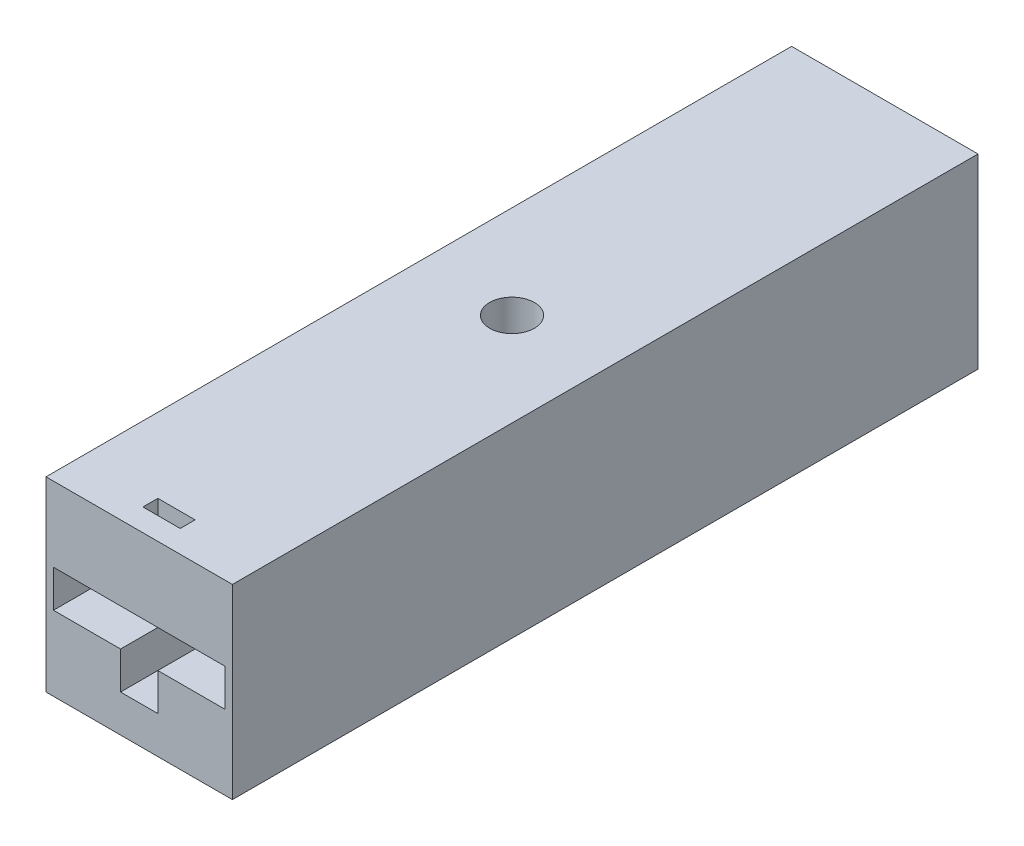
ISO-10303-21;
HEADER;
FILE_DESCRIPTION(('STEP AP214'),'2;1');
FILE_NAME('part.step','',(''),(''),'','','');
FILE_SCHEMA(('AUTOMOTIVE_DESIGN { 1 0 10303 214 1 1 1 1 }'));
ENDSEC;
DATA;
#1=APPLICATION_CONTEXT('core data for automotive mechanical design processes');
#2=APPLICATION_PROTOCOL_DEFINITION('international standard','automotive_design',2000,#1);
#3=PRODUCT_CONTEXT('',#1,'mechanical');
#4=PRODUCT('Part','Part','',(#3));
#5=PRODUCT_RELATED_PRODUCT_CATEGORY('part','',(#4));
#6=PRODUCT_DEFINITION_FORMATION('','',#4);
#7=PRODUCT_DEFINITION_CONTEXT('part definition',#1,'design');
#8=PRODUCT_DEFINITION('design','',#6,#7);
#9=PRODUCT_DEFINITION_SHAPE('','',#8);
#10=(LENGTH_UNIT() NAMED_UNIT(*) SI_UNIT(.MILLI.,.METRE.));
#11=(NAMED_UNIT(*) PLANE_ANGLE_UNIT() SI_UNIT($,.RADIAN.));
#12=(NAMED_UNIT(*) SI_UNIT($,.STERADIAN.) SOLID_ANGLE_UNIT());
#13=UNCERTAINTY_MEASURE_WITH_UNIT(LENGTH_MEASURE(1.E-05),#10,'distance_accuracy_value','');
#14=(GEOMETRIC_REPRESENTATION_CONTEXT(3) GLOBAL_UNCERTAINTY_ASSIGNED_CONTEXT((#13)) GLOBAL_UNIT_ASSIGNED_CONTEXT((#10,
#11,#12)) REPRESENTATION_CONTEXT('',''));
#15=CARTESIAN_POINT('',(0.,0.,0.));
#16=DIRECTION('',(0.,0.,1.));
#17=DIRECTION('',(1.,0.,0.));
#18=AXIS2_PLACEMENT_3D('',#15,#16,#17);
#19=CARTESIAN_POINT('',(0.,0.,0.));
#20=DIRECTION('',(0.,0.,-1.));
#21=DIRECTION('',(-1.,0.,0.));
#22=AXIS2_PLACEMENT_3D('',#19,#20,#21);
#23=PLANE('',#22);
#24=DIRECTION('',(0.,1.,0.));
#25=VECTOR('',#24,1.);
#26=CARTESIAN_POINT('',(12.5,-12.5,0.));
#27=LINE('',#26,#25);
#28=CARTESIAN_POINT('',(12.5,-12.5,0.));
#29=VERTEX_POINT('',#28);
#30=CARTESIAN_POINT('',(12.5,12.5,0.));
#31=VERTEX_POINT('',#30);
#32=EDGE_CURVE('E384',#29,#31,#27,.T.);
#33=ORIENTED_EDGE('',*,*,#32,.F.);
#34=DIRECTION('',(1.,0.,0.));
#35=VECTOR('',#34,1.);
#36=CARTESIAN_POINT('',(-12.5,-12.5,0.));
#37=LINE('',#36,#35);
#38=CARTESIAN_POINT('',(-12.5,-12.5,0.));
#39=VERTEX_POINT('',#38);
#40=EDGE_CURVE('E403',#39,#29,#37,.T.);
#41=ORIENTED_EDGE('',*,*,#40,.F.);
#42=DIRECTION('',(0.,-1.,0.));
#43=VECTOR('',#42,1.);
#44=CARTESIAN_POINT('',(-12.5,-12.5,0.));
#45=LINE('',#44,#43);
#46=CARTESIAN_POINT('',(-12.5,12.5,0.));
#47=VERTEX_POINT('',#46);
#48=EDGE_CURVE('E414',#47,#39,#45,.T.);
#49=ORIENTED_EDGE('',*,*,#48,.F.);
#50=DIRECTION('',(-1.,0.,0.));
#51=VECTOR('',#50,1.);
#52=CARTESIAN_POINT('',(-12.5,12.5,0.));
#53=LINE('',#52,#51);
#54=EDGE_CURVE('E412',#31,#47,#53,.T.);
#55=ORIENTED_EDGE('',*,*,#54,.F.);
#56=EDGE_LOOP('',(#33,#41,#49,#55));
#57=FACE_BOUND('',#56,.T.);
#58=DIRECTION('',(0.,1.,0.));
#59=VECTOR('',#58,1.);
#60=CARTESIAN_POINT('',(7.5,-2.5,0.));
#61=LINE('',#60,#59);
#62=CARTESIAN_POINT('',(7.5,-2.5,0.));
#63=VERTEX_POINT('',#62);
#64=CARTESIAN_POINT('',(7.5,2.5,0.));
#65=VERTEX_POINT('',#64);
#66=EDGE_CURVE('E276',#63,#65,#61,.T.);
#67=ORIENTED_EDGE('',*,*,#66,.T.);
#68=DIRECTION('',(-1.,0.,0.));
#69=VECTOR('',#68,1.);
#70=CARTESIAN_POINT('',(7.5,2.5,0.));
#71=LINE('',#70,#69);
#72=CARTESIAN_POINT('',(2.5,2.5,0.));
#73=VERTEX_POINT('',#72);
#74=EDGE_CURVE('E265',#65,#73,#71,.T.);
#75=ORIENTED_EDGE('',*,*,#74,.T.);
#76=DIRECTION('',(0.,1.,0.));
#77=VECTOR('',#76,1.);
#78=CARTESIAN_POINT('',(2.5,2.5,0.));
#79=LINE('',#78,#77);
#80=CARTESIAN_POINT('',(2.5,11.5,0.));
#81=VERTEX_POINT('',#80);
#82=EDGE_CURVE('E293',#73,#81,#79,.T.);
#83=ORIENTED_EDGE('',*,*,#82,.T.);
#84=DIRECTION('',(-1.,0.,0.));
#85=VECTOR('',#84,1.);
#86=CARTESIAN_POINT('',(2.5,11.5,0.));
#87=LINE('',#86,#85);
#88=CARTESIAN_POINT('',(-2.5,11.5,0.));
#89=VERTEX_POINT('',#88);
#90=EDGE_CURVE('E296',#81,#89,#87,.T.);
#91=ORIENTED_EDGE('',*,*,#90,.T.);
#92=DIRECTION('',(0.,-1.,0.));
#93=VECTOR('',#92,1.);
#94=CARTESIAN_POINT('',(-2.5,11.5,0.));
#95=LINE('',#94,#93);
#96=CARTESIAN_POINT('',(-2.5,-11.5,0.));
#97=VERTEX_POINT('',#96);
#98=EDGE_CURVE('E299',#89,#97,#95,.T.);
#99=ORIENTED_EDGE('',*,*,#98,.T.);
#100=DIRECTION('',(1.,0.,0.));
#101=VECTOR('',#100,1.);
#102=CARTESIAN_POINT('',(-2.5,-11.5,0.));
#103=LINE('',#102,#101);
#104=CARTESIAN_POINT('',(2.50000000000001,-11.5,0.));
#105=VERTEX_POINT('',#104);
#106=EDGE_CURVE('E302',#97,#105,#103,.T.);
#107=ORIENTED_EDGE('',*,*,#106,.T.);
#108=DIRECTION('',(0.,1.,0.));
#109=VECTOR('',#108,1.);
#110=CARTESIAN_POINT('',(2.50000000000001,-11.5,0.));
#111=LINE('',#110,#109);
#112=CARTESIAN_POINT('',(2.50000000000001,-2.5,0.));
#113=VERTEX_POINT('',#112);
#114=EDGE_CURVE('E305',#105,#113,#111,.T.);
#115=ORIENTED_EDGE('',*,*,#114,.T.);
#116=DIRECTION('',(1.,0.,0.));
#117=VECTOR('',#116,1.);
#118=CARTESIAN_POINT('',(2.50000000000001,-2.5,0.));
#119=LINE('',#118,#117);
#120=EDGE_CURVE('E308',#113,#63,#119,.T.);
#121=ORIENTED_EDGE('',*,*,#120,.T.);
#122=EDGE_LOOP('',(#67,#75,#83,#91,#99,#107,#115,#121));
#123=FACE_BOUND('',#122,.T.);
#124=ADVANCED_FACE('F39',(#57,#123),#23,.T.);
#125=CARTESIAN_POINT('',(12.5,-12.5,100.));
#126=DIRECTION('',(-1.,0.,0.));
#127=DIRECTION('',(0.,0.,1.));
#128=AXIS2_PLACEMENT_3D('',#125,#126,#127);
#129=PLANE('',#128);
#130=ORIENTED_EDGE('',*,*,#32,.T.);
#131=DIRECTION('',(0.,0.,-1.));
#132=VECTOR('',#131,1.);
#133=CARTESIAN_POINT('',(12.5,12.5,100.));
#134=LINE('',#133,#132);
#135=CARTESIAN_POINT('',(12.5,12.5,100.));
#136=VERTEX_POINT('',#135);
#137=EDGE_CURVE('E425',#136,#31,#134,.T.);
#138=ORIENTED_EDGE('',*,*,#137,.F.);
#139=DIRECTION('',(0.,1.,0.));
#140=VECTOR('',#139,1.);
#141=CARTESIAN_POINT('',(12.5,-12.5,100.));
#142=LINE('',#141,#140);
#143=CARTESIAN_POINT('',(12.5,-12.5,100.));
#144=VERTEX_POINT('',#143);
#145=EDGE_CURVE('E399',#144,#136,#142,.T.);
#146=ORIENTED_EDGE('',*,*,#145,.F.);
#147=DIRECTION('',(0.,0.,-1.));
#148=VECTOR('',#147,1.);
#149=CARTESIAN_POINT('',(12.5,-12.5,100.));
#150=LINE('',#149,#148);
#151=EDGE_CURVE('E409',#144,#29,#150,.T.);
#152=ORIENTED_EDGE('',*,*,#151,.T.);
#153=EDGE_LOOP('',(#130,#138,#146,#152));
#154=FACE_BOUND('',#153,.T.);
#155=ADVANCED_FACE('F41',(#154),#129,.F.);
#156=CARTESIAN_POINT('',(-12.5,12.5,100.));
#157=DIRECTION('',(0.,-1.,0.));
#158=DIRECTION('',(0.,0.,-1.));
#159=AXIS2_PLACEMENT_3D('',#156,#157,#158);
#160=PLANE('',#159);
#161=DIRECTION('',(-1.,0.,0.));
#162=VECTOR('',#161,1.);
#163=CARTESIAN_POINT('',(-2.50000000000002,12.5,95.));
#164=LINE('',#163,#162);
#165=CARTESIAN_POINT('',(2.49999999999998,12.5,95.));
#166=VERTEX_POINT('',#165);
#167=CARTESIAN_POINT('',(-2.50000000000002,12.5,95.));
#168=VERTEX_POINT('',#167);
#169=EDGE_CURVE('E253',#166,#168,#164,.T.);
#170=ORIENTED_EDGE('',*,*,#169,.F.);
#171=DIRECTION('',(0.,0.,-1.));
#172=VECTOR('',#171,1.);
#173=CARTESIAN_POINT('',(2.49999999999998,12.5,97.));
#174=LINE('',#173,#172);
#175=CARTESIAN_POINT('',(2.49999999999998,12.5,97.));
#176=VERTEX_POINT('',#175);
#177=EDGE_CURVE('E249',#176,#166,#174,.T.);
#178=ORIENTED_EDGE('',*,*,#177,.F.);
#179=DIRECTION('',(1.,0.,0.));
#180=VECTOR('',#179,1.);
#181=CARTESIAN_POINT('',(-2.50000000000002,12.5,97.));
#182=LINE('',#181,#180);
#183=CARTESIAN_POINT('',(-2.50000000000002,12.5,97.));
#184=VERTEX_POINT('',#183);
#185=EDGE_CURVE('E259',#184,#176,#182,.T.);
#186=ORIENTED_EDGE('',*,*,#185,.F.);
#187=DIRECTION('',(0.,0.,1.));
#188=VECTOR('',#187,1.);
#189=CARTESIAN_POINT('',(-2.50000000000002,12.5,97.));
#190=LINE('',#189,#188);
#191=EDGE_CURVE('E256',#168,#184,#190,.T.);
#192=ORIENTED_EDGE('',*,*,#191,.F.);
#193=EDGE_LOOP('',(#170,#178,#186,#192));
#194=FACE_BOUND('',#193,.T.);
#195=CARTESIAN_POINT('',(0.,12.5,50.));
#196=DIRECTION('',(0.,1.,0.));
#197=DIRECTION('',(0.,0.,1.));
#198=AXIS2_PLACEMENT_3D('',#195,#196,#197);
#199=CIRCLE('',#198,3.);
#200=CARTESIAN_POINT('',(0.,12.5,53.));
#201=VERTEX_POINT('',#200);
#202=EDGE_CURVE('E330',#201,#201,#199,.T.);
#203=ORIENTED_EDGE('',*,*,#202,.F.);
#204=EDGE_LOOP('',(#203));
#205=FACE_BOUND('',#204,.T.);
#206=ORIENTED_EDGE('',*,*,#54,.T.);
#207=DIRECTION('',(0.,0.,-1.));
#208=VECTOR('',#207,1.);
#209=CARTESIAN_POINT('',(-12.5,12.5,100.));
#210=LINE('',#209,#208);
#211=CARTESIAN_POINT('',(-12.5,12.5,100.));
#212=VERTEX_POINT('',#211);
#213=EDGE_CURVE('E422',#212,#47,#210,.T.);
#214=ORIENTED_EDGE('',*,*,#213,.F.);
#215=DIRECTION('',(-1.,0.,0.));
#216=VECTOR('',#215,1.);
#217=CARTESIAN_POINT('',(-12.5,12.5,100.));
#218=LINE('',#217,#216);
#219=EDGE_CURVE('E402',#136,#212,#218,.T.);
#220=ORIENTED_EDGE('',*,*,#219,.F.);
#221=ORIENTED_EDGE('',*,*,#137,.T.);
#222=EDGE_LOOP('',(#206,#214,#220,#221));
#223=FACE_BOUND('',#222,.T.);
#224=ADVANCED_FACE('F475',(#194,#205,#223),#160,.F.);
#225=CARTESIAN_POINT('',(-12.5,-12.5,100.));
#226=DIRECTION('',(1.,0.,0.));
#227=DIRECTION('',(0.,0.,-1.));
#228=AXIS2_PLACEMENT_3D('',#225,#226,#227);
#229=PLANE('',#228);
#230=DIRECTION('',(0.,0.,-1.));
#231=VECTOR('',#230,1.);
#232=CARTESIAN_POINT('',(-12.5,2.5,3.));
#233=LINE('',#232,#231);
#234=CARTESIAN_POINT('',(-12.5,2.5,5.));
#235=VERTEX_POINT('',#234);
#236=CARTESIAN_POINT('',(-12.5,2.5,3.));
#237=VERTEX_POINT('',#236);
#238=EDGE_CURVE('E235',#235,#237,#233,.T.);
#239=ORIENTED_EDGE('',*,*,#238,.F.);
#240=DIRECTION('',(0.,1.,0.));
#241=VECTOR('',#240,1.);
#242=CARTESIAN_POINT('',(-12.5,-2.5,5.));
#243=LINE('',#242,#241);
#244=CARTESIAN_POINT('',(-12.5,-2.5,5.));
#245=VERTEX_POINT('',#244);
#246=EDGE_CURVE('E54',#245,#235,#243,.T.);
#247=ORIENTED_EDGE('',*,*,#246,.F.);
#248=DIRECTION('',(0.,0.,1.));
#249=VECTOR('',#248,1.);
#250=CARTESIAN_POINT('',(-12.5,-2.5,3.));
#251=LINE('',#250,#249);
#252=CARTESIAN_POINT('',(-12.5,-2.5,3.));
#253=VERTEX_POINT('',#252);
#254=EDGE_CURVE('E242',#253,#245,#251,.T.);
#255=ORIENTED_EDGE('',*,*,#254,.F.);
#256=DIRECTION('',(0.,-1.,0.));
#257=VECTOR('',#256,1.);
#258=CARTESIAN_POINT('',(-12.5,-2.5,3.));
#259=LINE('',#258,#257);
#260=EDGE_CURVE('E226',#237,#253,#259,.T.);
#261=ORIENTED_EDGE('',*,*,#260,.F.);
#262=EDGE_LOOP('',(#239,#247,#255,#261));
#263=FACE_BOUND('',#262,.T.);
#264=ORIENTED_EDGE('',*,*,#48,.T.);
#265=DIRECTION('',(0.,0.,-1.));
#266=VECTOR('',#265,1.);
#267=CARTESIAN_POINT('',(-12.5,-12.5,100.));
#268=LINE('',#267,#266);
#269=CARTESIAN_POINT('',(-12.5,-12.5,100.));
#270=VERTEX_POINT('',#269);
#271=EDGE_CURVE('E419',#270,#39,#268,.T.);
#272=ORIENTED_EDGE('',*,*,#271,.F.);
#273=DIRECTION('',(0.,-1.,0.));
#274=VECTOR('',#273,1.);
#275=CARTESIAN_POINT('',(-12.5,-12.5,100.));
#276=LINE('',#275,#274);
#277=EDGE_CURVE('E405',#212,#270,#276,.T.);
#278=ORIENTED_EDGE('',*,*,#277,.F.);
#279=ORIENTED_EDGE('',*,*,#213,.T.);
#280=EDGE_LOOP('',(#264,#272,#278,#279));
#281=FACE_BOUND('',#280,.T.);
#282=ADVANCED_FACE('F239',(#263,#281),#229,.F.);
#283=CARTESIAN_POINT('',(-12.5,-12.5,100.));
#284=DIRECTION('',(0.,1.,0.));
#285=DIRECTION('',(0.,0.,1.));
#286=AXIS2_PLACEMENT_3D('',#283,#284,#285);
#287=PLANE('',#286);
#288=CARTESIAN_POINT('',(0.,-12.5,50.));
#289=DIRECTION('',(0.,1.,0.));
#290=DIRECTION('',(0.,0.,1.));
#291=AXIS2_PLACEMENT_3D('',#288,#289,#290);
#292=CIRCLE('',#291,3.);
#293=CARTESIAN_POINT('',(0.,-12.5,53.));
#294=VERTEX_POINT('',#293);
#295=EDGE_CURVE('E333',#294,#294,#292,.T.);
#296=ORIENTED_EDGE('',*,*,#295,.T.);
#297=EDGE_LOOP('',(#296));
#298=FACE_BOUND('',#297,.T.);
#299=ORIENTED_EDGE('',*,*,#40,.T.);
#300=ORIENTED_EDGE('',*,*,#151,.F.);
#301=DIRECTION('',(1.,0.,0.));
#302=VECTOR('',#301,1.);
#303=CARTESIAN_POINT('',(-12.5,-12.5,100.));
#304=LINE('',#303,#302);
#305=EDGE_CURVE('E407',#270,#144,#304,.T.);
#306=ORIENTED_EDGE('',*,*,#305,.F.);
#307=ORIENTED_EDGE('',*,*,#271,.T.);
#308=EDGE_LOOP('',(#299,#300,#306,#307));
#309=FACE_BOUND('',#308,.T.);
#310=ADVANCED_FACE('F483',(#298,#309),#287,.F.);
#311=CARTESIAN_POINT('',(0.,0.,100.));
#312=DIRECTION('',(0.,0.,-1.));
#313=DIRECTION('',(-1.,0.,0.));
#314=AXIS2_PLACEMENT_3D('',#311,#312,#313);
#315=PLANE('',#314);
#316=DIRECTION('',(-1.,0.,0.));
#317=VECTOR('',#316,1.);
#318=CARTESIAN_POINT('',(-11.5,2.5,100.));
#319=LINE('',#318,#317);
#320=CARTESIAN_POINT('',(11.5,2.5,100.));
#321=VERTEX_POINT('',#320);
#322=CARTESIAN_POINT('',(-11.5,2.5,100.));
#323=VERTEX_POINT('',#322);
#324=EDGE_CURVE('E362',#321,#323,#319,.T.);
#325=ORIENTED_EDGE('',*,*,#324,.F.);
#326=DIRECTION('',(0.,1.,0.));
#327=VECTOR('',#326,1.);
#328=CARTESIAN_POINT('',(11.5,2.5,100.));
#329=LINE('',#328,#327);
#330=CARTESIAN_POINT('',(11.5,-2.5,100.));
#331=VERTEX_POINT('',#330);
#332=EDGE_CURVE('E360',#331,#321,#329,.T.);
#333=ORIENTED_EDGE('',*,*,#332,.F.);
#334=DIRECTION('',(1.,0.,0.));
#335=VECTOR('',#334,1.);
#336=CARTESIAN_POINT('',(11.5,-2.5,100.));
#337=LINE('',#336,#335);
#338=CARTESIAN_POINT('',(2.5,-2.5,100.));
#339=VERTEX_POINT('',#338);
#340=EDGE_CURVE('E338',#339,#331,#337,.T.);
#341=ORIENTED_EDGE('',*,*,#340,.F.);
#342=DIRECTION('',(0.,1.,0.));
#343=VECTOR('',#342,1.);
#344=CARTESIAN_POINT('',(2.5,-2.5,100.));
#345=LINE('',#344,#343);
#346=CARTESIAN_POINT('',(2.5,-7.5,100.));
#347=VERTEX_POINT('',#346);
#348=EDGE_CURVE('E377',#347,#339,#345,.T.);
#349=ORIENTED_EDGE('',*,*,#348,.F.);
#350=DIRECTION('',(1.,0.,0.));
#351=VECTOR('',#350,1.);
#352=CARTESIAN_POINT('',(2.5,-7.5,100.));
#353=LINE('',#352,#351);
#354=CARTESIAN_POINT('',(-2.5,-7.5,100.));
#355=VERTEX_POINT('',#354);
#356=EDGE_CURVE('E374',#355,#347,#353,.T.);
#357=ORIENTED_EDGE('',*,*,#356,.F.);
#358=DIRECTION('',(0.,-1.,0.));
#359=VECTOR('',#358,1.);
#360=CARTESIAN_POINT('',(-2.5,-7.5,100.));
#361=LINE('',#360,#359);
#362=CARTESIAN_POINT('',(-2.5,-2.5,100.));
#363=VERTEX_POINT('',#362);
#364=EDGE_CURVE('E371',#363,#355,#361,.T.);
#365=ORIENTED_EDGE('',*,*,#364,.F.);
#366=DIRECTION('',(1.,0.,0.));
#367=VECTOR('',#366,1.);
#368=CARTESIAN_POINT('',(-2.5,-2.5,100.));
#369=LINE('',#368,#367);
#370=CARTESIAN_POINT('',(-11.5,-2.5,100.));
#371=VERTEX_POINT('',#370);
#372=EDGE_CURVE('E368',#371,#363,#369,.T.);
#373=ORIENTED_EDGE('',*,*,#372,.F.);
#374=DIRECTION('',(0.,-1.,0.));
#375=VECTOR('',#374,1.);
#376=CARTESIAN_POINT('',(-11.5,-2.5,100.));
#377=LINE('',#376,#375);
#378=EDGE_CURVE('E365',#323,#371,#377,.T.);
#379=ORIENTED_EDGE('',*,*,#378,.F.);
#380=EDGE_LOOP('',(#325,#333,#341,#349,#357,#365,#373,#379));
#381=FACE_BOUND('',#380,.T.);
#382=ORIENTED_EDGE('',*,*,#145,.T.);
#383=ORIENTED_EDGE('',*,*,#219,.T.);
#384=ORIENTED_EDGE('',*,*,#277,.T.);
#385=ORIENTED_EDGE('',*,*,#305,.T.);
#386=EDGE_LOOP('',(#382,#383,#384,#385));
#387=FACE_BOUND('',#386,.T.);
#388=ADVANCED_FACE('F481',(#381,#387),#315,.F.);
#389=CARTESIAN_POINT('',(11.5,2.5,90.));
#390=DIRECTION('',(1.,0.,0.));
#391=DIRECTION('',(0.,0.,-1.));
#392=AXIS2_PLACEMENT_3D('',#389,#390,#391);
#393=PLANE('',#392);
#394=ORIENTED_EDGE('',*,*,#332,.T.);
#395=DIRECTION('',(0.,0.,1.));
#396=VECTOR('',#395,1.);
#397=CARTESIAN_POINT('',(11.5,2.5,90.));
#398=LINE('',#397,#396);
#399=CARTESIAN_POINT('',(11.5,2.5,90.));
#400=VERTEX_POINT('',#399);
#401=EDGE_CURVE('E359',#400,#321,#398,.T.);
#402=ORIENTED_EDGE('',*,*,#401,.F.);
#403=DIRECTION('',(0.,1.,0.));
#404=VECTOR('',#403,1.);
#405=CARTESIAN_POINT('',(11.5,2.5,90.));
#406=LINE('',#405,#404);
#407=CARTESIAN_POINT('',(11.5,-2.5,90.));
#408=VERTEX_POINT('',#407);
#409=EDGE_CURVE('E334',#408,#400,#406,.T.);
#410=ORIENTED_EDGE('',*,*,#409,.F.);
#411=DIRECTION('',(0.,0.,1.));
#412=VECTOR('',#411,1.);
#413=CARTESIAN_POINT('',(11.5,-2.5,90.));
#414=LINE('',#413,#412);
#415=EDGE_CURVE('E382',#408,#331,#414,.T.);
#416=ORIENTED_EDGE('',*,*,#415,.T.);
#417=EDGE_LOOP('',(#394,#402,#410,#416));
#418=FACE_BOUND('',#417,.T.);
#419=ADVANCED_FACE('F512',(#418),#393,.F.);
#420=CARTESIAN_POINT('',(11.5,-2.5,90.));
#421=DIRECTION('',(0.,-1.,0.));
#422=DIRECTION('',(1.,0.,0.));
#423=AXIS2_PLACEMENT_3D('',#420,#421,#422);
#424=PLANE('',#423);
#425=ORIENTED_EDGE('',*,*,#340,.T.);
#426=ORIENTED_EDGE('',*,*,#415,.F.);
#427=DIRECTION('',(1.,0.,0.));
#428=VECTOR('',#427,1.);
#429=CARTESIAN_POINT('',(11.5,-2.5,90.));
#430=LINE('',#429,#428);
#431=CARTESIAN_POINT('',(2.5,-2.5,90.));
#432=VERTEX_POINT('',#431);
#433=EDGE_CURVE('E356',#432,#408,#430,.T.);
#434=ORIENTED_EDGE('',*,*,#433,.F.);
#435=DIRECTION('',(0.,0.,1.));
#436=VECTOR('',#435,1.);
#437=CARTESIAN_POINT('',(2.5,-2.5,90.));
#438=LINE('',#437,#436);
#439=EDGE_CURVE('E385',#432,#339,#438,.T.);
#440=ORIENTED_EDGE('',*,*,#439,.T.);
#441=EDGE_LOOP('',(#425,#426,#434,#440));
#442=FACE_BOUND('',#441,.T.);
#443=ADVANCED_FACE('F517',(#442),#424,.F.);
#444=CARTESIAN_POINT('',(2.5,-2.5,90.));
#445=DIRECTION('',(1.,0.,0.));
#446=DIRECTION('',(0.,1.,0.));
#447=AXIS2_PLACEMENT_3D('',#444,#445,#446);
#448=PLANE('',#447);
#449=ORIENTED_EDGE('',*,*,#348,.T.);
#450=ORIENTED_EDGE('',*,*,#439,.F.);
#451=DIRECTION('',(0.,1.,0.));
#452=VECTOR('',#451,1.);
#453=CARTESIAN_POINT('',(2.5,-2.5,90.));
#454=LINE('',#453,#452);
#455=CARTESIAN_POINT('',(2.5,-7.5,90.));
#456=VERTEX_POINT('',#455);
#457=EDGE_CURVE('E353',#456,#432,#454,.T.);
#458=ORIENTED_EDGE('',*,*,#457,.F.);
#459=DIRECTION('',(0.,0.,1.));
#460=VECTOR('',#459,1.);
#461=CARTESIAN_POINT('',(2.5,-7.5,90.));
#462=LINE('',#461,#460);
#463=EDGE_CURVE('E387',#456,#347,#462,.T.);
#464=ORIENTED_EDGE('',*,*,#463,.T.);
#465=EDGE_LOOP('',(#449,#450,#458,#464));
#466=FACE_BOUND('',#465,.T.);
#467=ADVANCED_FACE('F535',(#466),#448,.F.);
#468=CARTESIAN_POINT('',(2.5,-7.5,90.));
#469=DIRECTION('',(0.,-1.,0.));
#470=DIRECTION('',(0.,0.,-1.));
#471=AXIS2_PLACEMENT_3D('',#468,#469,#470);
#472=PLANE('',#471);
#473=ORIENTED_EDGE('',*,*,#356,.T.);
#474=ORIENTED_EDGE('',*,*,#463,.F.);
#475=DIRECTION('',(1.,0.,0.));
#476=VECTOR('',#475,1.);
#477=CARTESIAN_POINT('',(2.5,-7.5,90.));
#478=LINE('',#477,#476);
#479=CARTESIAN_POINT('',(-2.5,-7.5,90.));
#480=VERTEX_POINT('',#479);
#481=EDGE_CURVE('E350',#480,#456,#478,.T.);
#482=ORIENTED_EDGE('',*,*,#481,.F.);
#483=DIRECTION('',(0.,0.,1.));
#484=VECTOR('',#483,1.);
#485=CARTESIAN_POINT('',(-2.5,-7.5,90.));
#486=LINE('',#485,#484);
#487=EDGE_CURVE('E389',#480,#355,#486,.T.);
#488=ORIENTED_EDGE('',*,*,#487,.T.);
#489=EDGE_LOOP('',(#473,#474,#482,#488));
#490=FACE_BOUND('',#489,.T.);
#491=ADVANCED_FACE('F539',(#490),#472,.F.);
#492=CARTESIAN_POINT('',(-2.5,-7.5,90.));
#493=DIRECTION('',(-1.,0.,0.));
#494=DIRECTION('',(0.,-1.,0.));
#495=AXIS2_PLACEMENT_3D('',#492,#493,#494);
#496=PLANE('',#495);
#497=ORIENTED_EDGE('',*,*,#364,.T.);
#498=ORIENTED_EDGE('',*,*,#487,.F.);
#499=DIRECTION('',(0.,-1.,0.));
#500=VECTOR('',#499,1.);
#501=CARTESIAN_POINT('',(-2.5,-7.5,90.));
#502=LINE('',#501,#500);
#503=CARTESIAN_POINT('',(-2.5,-2.5,90.));
#504=VERTEX_POINT('',#503);
#505=EDGE_CURVE('E347',#504,#480,#502,.T.);
#506=ORIENTED_EDGE('',*,*,#505,.F.);
#507=DIRECTION('',(0.,0.,1.));
#508=VECTOR('',#507,1.);
#509=CARTESIAN_POINT('',(-2.5,-2.5,90.));
#510=LINE('',#509,#508);
#511=EDGE_CURVE('E391',#504,#363,#510,.T.);
#512=ORIENTED_EDGE('',*,*,#511,.T.);
#513=EDGE_LOOP('',(#497,#498,#506,#512));
#514=FACE_BOUND('',#513,.T.);
#515=ADVANCED_FACE('F542',(#514),#496,.F.);
#516=CARTESIAN_POINT('',(-2.5,-2.5,90.));
#517=DIRECTION('',(0.,-1.,0.));
#518=DIRECTION('',(1.,0.,0.));
#519=AXIS2_PLACEMENT_3D('',#516,#517,#518);
#520=PLANE('',#519);
#521=ORIENTED_EDGE('',*,*,#372,.T.);
#522=ORIENTED_EDGE('',*,*,#511,.F.);
#523=DIRECTION('',(1.,0.,0.));
#524=VECTOR('',#523,1.);
#525=CARTESIAN_POINT('',(-2.5,-2.5,90.));
#526=LINE('',#525,#524);
#527=CARTESIAN_POINT('',(-11.5,-2.5,90.));
#528=VERTEX_POINT('',#527);
#529=EDGE_CURVE('E344',#528,#504,#526,.T.);
#530=ORIENTED_EDGE('',*,*,#529,.F.);
#531=DIRECTION('',(0.,0.,1.));
#532=VECTOR('',#531,1.);
#533=CARTESIAN_POINT('',(-11.5,-2.5,90.));
#534=LINE('',#533,#532);
#535=EDGE_CURVE('E393',#528,#371,#534,.T.);
#536=ORIENTED_EDGE('',*,*,#535,.T.);
#537=EDGE_LOOP('',(#521,#522,#530,#536));
#538=FACE_BOUND('',#537,.T.);
#539=ADVANCED_FACE('F544',(#538),#520,.F.);
#540=CARTESIAN_POINT('',(-11.5,-2.5,90.));
#541=DIRECTION('',(-1.,0.,0.));
#542=DIRECTION('',(0.,0.,1.));
#543=AXIS2_PLACEMENT_3D('',#540,#541,#542);
#544=PLANE('',#543);
#545=ORIENTED_EDGE('',*,*,#378,.T.);
#546=ORIENTED_EDGE('',*,*,#535,.F.);
#547=DIRECTION('',(0.,-1.,0.));
#548=VECTOR('',#547,1.);
#549=CARTESIAN_POINT('',(-11.5,-2.5,90.));
#550=LINE('',#549,#548);
#551=CARTESIAN_POINT('',(-11.5,2.5,90.));
#552=VERTEX_POINT('',#551);
#553=EDGE_CURVE('E341',#552,#528,#550,.T.);
#554=ORIENTED_EDGE('',*,*,#553,.F.);
#555=DIRECTION('',(0.,0.,1.));
#556=VECTOR('',#555,1.);
#557=CARTESIAN_POINT('',(-11.5,2.5,90.));
#558=LINE('',#557,#556);
#559=EDGE_CURVE('E395',#552,#323,#558,.T.);
#560=ORIENTED_EDGE('',*,*,#559,.T.);
#561=EDGE_LOOP('',(#545,#546,#554,#560));
#562=FACE_BOUND('',#561,.T.);
#563=ADVANCED_FACE('F547',(#562),#544,.F.);
#564=CARTESIAN_POINT('',(-11.5,2.5,90.));
#565=DIRECTION('',(0.,1.,0.));
#566=DIRECTION('',(0.,0.,1.));
#567=AXIS2_PLACEMENT_3D('',#564,#565,#566);
#568=PLANE('',#567);
#569=DIRECTION('',(1.,0.,0.));
#570=VECTOR('',#569,1.);
#571=CARTESIAN_POINT('',(-11.5,2.5,97.));
#572=LINE('',#571,#570);
#573=CARTESIAN_POINT('',(-2.50000000000002,2.5,97.));
#574=VERTEX_POINT('',#573);
#575=CARTESIAN_POINT('',(2.49999999999998,2.5,97.));
#576=VERTEX_POINT('',#575);
#577=EDGE_CURVE('E436',#574,#576,#572,.T.);
#578=ORIENTED_EDGE('',*,*,#577,.T.);
#579=DIRECTION('',(0.,0.,-1.));
#580=VECTOR('',#579,1.);
#581=CARTESIAN_POINT('',(2.49999999999998,2.5,90.));
#582=LINE('',#581,#580);
#583=CARTESIAN_POINT('',(2.49999999999998,2.5,95.));
#584=VERTEX_POINT('',#583);
#585=EDGE_CURVE('E439',#576,#584,#582,.T.);
#586=ORIENTED_EDGE('',*,*,#585,.T.);
#587=DIRECTION('',(-1.,0.,0.));
#588=VECTOR('',#587,1.);
#589=CARTESIAN_POINT('',(-11.5,2.5,95.));
#590=LINE('',#589,#588);
#591=CARTESIAN_POINT('',(-2.50000000000002,2.5,95.));
#592=VERTEX_POINT('',#591);
#593=EDGE_CURVE('E428',#584,#592,#590,.T.);
#594=ORIENTED_EDGE('',*,*,#593,.T.);
#595=DIRECTION('',(0.,0.,1.));
#596=VECTOR('',#595,1.);
#597=CARTESIAN_POINT('',(-2.50000000000002,2.5,90.));
#598=LINE('',#597,#596);
#599=EDGE_CURVE('E433',#592,#574,#598,.T.);
#600=ORIENTED_EDGE('',*,*,#599,.T.);
#601=EDGE_LOOP('',(#578,#586,#594,#600));
#602=FACE_BOUND('',#601,.T.);
#603=ORIENTED_EDGE('',*,*,#324,.T.);
#604=ORIENTED_EDGE('',*,*,#559,.F.);
#605=DIRECTION('',(-1.,0.,0.));
#606=VECTOR('',#605,1.);
#607=CARTESIAN_POINT('',(-11.5,2.5,90.));
#608=LINE('',#607,#606);
#609=EDGE_CURVE('E337',#400,#552,#608,.T.);
#610=ORIENTED_EDGE('',*,*,#609,.F.);
#611=ORIENTED_EDGE('',*,*,#401,.T.);
#612=EDGE_LOOP('',(#603,#604,#610,#611));
#613=FACE_BOUND('',#612,.T.);
#614=ADVANCED_FACE('F525',(#602,#613),#568,.F.);
#615=CARTESIAN_POINT('',(0.,0.,90.));
#616=DIRECTION('',(0.,0.,-1.));
#617=DIRECTION('',(-1.,0.,0.));
#618=AXIS2_PLACEMENT_3D('',#615,#616,#617);
#619=PLANE('',#618);
#620=ORIENTED_EDGE('',*,*,#409,.T.);
#621=ORIENTED_EDGE('',*,*,#609,.T.);
#622=ORIENTED_EDGE('',*,*,#553,.T.);
#623=ORIENTED_EDGE('',*,*,#529,.T.);
#624=ORIENTED_EDGE('',*,*,#505,.T.);
#625=ORIENTED_EDGE('',*,*,#481,.T.);
#626=ORIENTED_EDGE('',*,*,#457,.T.);
#627=ORIENTED_EDGE('',*,*,#433,.T.);
#628=EDGE_LOOP('',(#620,#621,#622,#623,#624,#625,#626,#627));
#629=FACE_BOUND('',#628,.T.);
#630=ADVANCED_FACE('F549',(#629),#619,.F.);
#631=CARTESIAN_POINT('',(0.,-41.5,50.));
#632=DIRECTION('',(0.,1.,0.));
#633=DIRECTION('',(0.,0.,1.));
#634=AXIS2_PLACEMENT_3D('',#631,#632,#633);
#635=CYLINDRICAL_SURFACE('',#634,3.);
#636=ORIENTED_EDGE('',*,*,#202,.T.);
#637=EDGE_LOOP('',(#636));
#638=FACE_BOUND('',#637,.T.);
#639=ORIENTED_EDGE('',*,*,#295,.F.);
#640=EDGE_LOOP('',(#639));
#641=FACE_BOUND('',#640,.T.);
#642=ADVANCED_FACE('F551',(#638,#641),#635,.F.);
#643=CARTESIAN_POINT('',(7.5,2.5,10.));
#644=DIRECTION('',(0.,-1.,0.));
#645=DIRECTION('',(1.,0.,0.));
#646=AXIS2_PLACEMENT_3D('',#643,#644,#645);
#647=PLANE('',#646);
#648=ORIENTED_EDGE('',*,*,#74,.F.);
#649=DIRECTION('',(0.,0.,-1.));
#650=VECTOR('',#649,1.);
#651=CARTESIAN_POINT('',(7.5,2.5,10.));
#652=LINE('',#651,#650);
#653=CARTESIAN_POINT('',(7.5,2.5,10.));
#654=VERTEX_POINT('',#653);
#655=EDGE_CURVE('E290',#654,#65,#652,.T.);
#656=ORIENTED_EDGE('',*,*,#655,.F.);
#657=DIRECTION('',(-1.,0.,0.));
#658=VECTOR('',#657,1.);
#659=CARTESIAN_POINT('',(7.5,2.5,10.));
#660=LINE('',#659,#658);
#661=CARTESIAN_POINT('',(2.5,2.5,10.));
#662=VERTEX_POINT('',#661);
#663=EDGE_CURVE('E272',#654,#662,#660,.T.);
#664=ORIENTED_EDGE('',*,*,#663,.T.);
#665=DIRECTION('',(0.,0.,-1.));
#666=VECTOR('',#665,1.);
#667=CARTESIAN_POINT('',(2.5,2.5,10.));
#668=LINE('',#667,#666);
#669=EDGE_CURVE('E327',#662,#73,#668,.T.);
#670=ORIENTED_EDGE('',*,*,#669,.T.);
#671=EDGE_LOOP('',(#648,#656,#664,#670));
#672=FACE_BOUND('',#671,.T.);
#673=ADVANCED_FACE('F556',(#672),#647,.T.);
#674=CARTESIAN_POINT('',(2.5,2.5,10.));
#675=DIRECTION('',(-1.,0.,0.));
#676=DIRECTION('',(0.,-1.,0.));
#677=AXIS2_PLACEMENT_3D('',#674,#675,#676);
#678=PLANE('',#677);
#679=ORIENTED_EDGE('',*,*,#82,.F.);
#680=ORIENTED_EDGE('',*,*,#669,.F.);
#681=DIRECTION('',(0.,1.,0.));
#682=VECTOR('',#681,1.);
#683=CARTESIAN_POINT('',(2.5,2.5,10.));
#684=LINE('',#683,#682);
#685=CARTESIAN_POINT('',(2.5,11.5,10.));
#686=VERTEX_POINT('',#685);
#687=EDGE_CURVE('E275',#662,#686,#684,.T.);
#688=ORIENTED_EDGE('',*,*,#687,.T.);
#689=DIRECTION('',(0.,0.,-1.));
#690=VECTOR('',#689,1.);
#691=CARTESIAN_POINT('',(2.5,11.5,10.));
#692=LINE('',#691,#690);
#693=EDGE_CURVE('E325',#686,#81,#692,.T.);
#694=ORIENTED_EDGE('',*,*,#693,.T.);
#695=EDGE_LOOP('',(#679,#680,#688,#694));
#696=FACE_BOUND('',#695,.T.);
#697=ADVANCED_FACE('F760',(#696),#678,.T.);
#698=CARTESIAN_POINT('',(2.5,11.5,10.));
#699=DIRECTION('',(0.,-1.,0.));
#700=DIRECTION('',(0.,0.,-1.));
#701=AXIS2_PLACEMENT_3D('',#698,#699,#700);
#702=PLANE('',#701);
#703=ORIENTED_EDGE('',*,*,#90,.F.);
#704=ORIENTED_EDGE('',*,*,#693,.F.);
#705=DIRECTION('',(-1.,0.,0.));
#706=VECTOR('',#705,1.);
#707=CARTESIAN_POINT('',(2.5,11.5,10.));
#708=LINE('',#707,#706);
#709=CARTESIAN_POINT('',(-2.5,11.5,10.));
#710=VERTEX_POINT('',#709);
#711=EDGE_CURVE('E278',#686,#710,#708,.T.);
#712=ORIENTED_EDGE('',*,*,#711,.T.);
#713=DIRECTION('',(0.,0.,-1.));
#714=VECTOR('',#713,1.);
#715=CARTESIAN_POINT('',(-2.5,11.5,10.));
#716=LINE('',#715,#714);
#717=EDGE_CURVE('E323',#710,#89,#716,.T.);
#718=ORIENTED_EDGE('',*,*,#717,.T.);
#719=EDGE_LOOP('',(#703,#704,#712,#718));
#720=FACE_BOUND('',#719,.T.);
#721=ADVANCED_FACE('F642',(#720),#702,.T.);
#722=CARTESIAN_POINT('',(-2.5,11.5,10.));
#723=DIRECTION('',(1.,0.,0.));
#724=DIRECTION('',(0.,1.,0.));
#725=AXIS2_PLACEMENT_3D('',#722,#723,#724);
#726=PLANE('',#725);
#727=DIRECTION('',(0.,-1.,0.));
#728=VECTOR('',#727,1.);
#729=CARTESIAN_POINT('',(-2.5,11.5,5.));
#730=LINE('',#729,#728);
#731=CARTESIAN_POINT('',(-2.5,2.5,5.));
#732=VERTEX_POINT('',#731);
#733=CARTESIAN_POINT('',(-2.5,-2.5,5.));
#734=VERTEX_POINT('',#733);
#735=EDGE_CURVE('E11',#732,#734,#730,.T.);
#736=ORIENTED_EDGE('',*,*,#735,.F.);
#737=DIRECTION('',(0.,0.,1.));
#738=VECTOR('',#737,1.);
#739=CARTESIAN_POINT('',(-2.5,2.5,10.));
#740=LINE('',#739,#738);
#741=CARTESIAN_POINT('',(-2.5,2.5,3.));
#742=VERTEX_POINT('',#741);
#743=EDGE_CURVE('E442',#742,#732,#740,.T.);
#744=ORIENTED_EDGE('',*,*,#743,.F.);
#745=DIRECTION('',(0.,1.,0.));
#746=VECTOR('',#745,1.);
#747=CARTESIAN_POINT('',(-2.5,11.5,3.));
#748=LINE('',#747,#746);
#749=CARTESIAN_POINT('',(-2.5,-2.5,3.));
#750=VERTEX_POINT('',#749);
#751=EDGE_CURVE('E229',#750,#742,#748,.T.);
#752=ORIENTED_EDGE('',*,*,#751,.F.);
#753=DIRECTION('',(0.,0.,-1.));
#754=VECTOR('',#753,1.);
#755=CARTESIAN_POINT('',(-2.5,-2.5,10.));
#756=LINE('',#755,#754);
#757=EDGE_CURVE('E47',#734,#750,#756,.T.);
#758=ORIENTED_EDGE('',*,*,#757,.F.);
#759=EDGE_LOOP('',(#736,#744,#752,#758));
#760=FACE_BOUND('',#759,.T.);
#761=ORIENTED_EDGE('',*,*,#98,.F.);
#762=ORIENTED_EDGE('',*,*,#717,.F.);
#763=DIRECTION('',(0.,-1.,0.));
#764=VECTOR('',#763,1.);
#765=CARTESIAN_POINT('',(-2.5,11.5,10.));
#766=LINE('',#765,#764);
#767=CARTESIAN_POINT('',(-2.5,-11.5,10.));
#768=VERTEX_POINT('',#767);
#769=EDGE_CURVE('E280',#710,#768,#766,.T.);
#770=ORIENTED_EDGE('',*,*,#769,.T.);
#771=DIRECTION('',(0.,0.,-1.));
#772=VECTOR('',#771,1.);
#773=CARTESIAN_POINT('',(-2.5,-11.5,10.));
#774=LINE('',#773,#772);
#775=EDGE_CURVE('E321',#768,#97,#774,.T.);
#776=ORIENTED_EDGE('',*,*,#775,.T.);
#777=EDGE_LOOP('',(#761,#762,#770,#776));
#778=FACE_BOUND('',#777,.T.);
#779=ADVANCED_FACE('F450',(#760,#778),#726,.T.);
#780=CARTESIAN_POINT('',(-2.5,-11.5,10.));
#781=DIRECTION('',(0.,1.,0.));
#782=DIRECTION('',(0.,0.,1.));
#783=AXIS2_PLACEMENT_3D('',#780,#781,#782);
#784=PLANE('',#783);
#785=ORIENTED_EDGE('',*,*,#106,.F.);
#786=ORIENTED_EDGE('',*,*,#775,.F.);
#787=DIRECTION('',(1.,0.,0.));
#788=VECTOR('',#787,1.);
#789=CARTESIAN_POINT('',(-2.5,-11.5,10.));
#790=LINE('',#789,#788);
#791=CARTESIAN_POINT('',(2.50000000000001,-11.5,10.));
#792=VERTEX_POINT('',#791);
#793=EDGE_CURVE('E282',#768,#792,#790,.T.);
#794=ORIENTED_EDGE('',*,*,#793,.T.);
#795=DIRECTION('',(0.,0.,-1.));
#796=VECTOR('',#795,1.);
#797=CARTESIAN_POINT('',(2.50000000000001,-11.5,10.));
#798=LINE('',#797,#796);
#799=EDGE_CURVE('E319',#792,#105,#798,.T.);
#800=ORIENTED_EDGE('',*,*,#799,.T.);
#801=EDGE_LOOP('',(#785,#786,#794,#800));
#802=FACE_BOUND('',#801,.T.);
#803=ADVANCED_FACE('F641',(#802),#784,.T.);
#804=CARTESIAN_POINT('',(2.50000000000001,-11.5,10.));
#805=DIRECTION('',(-1.,0.,0.));
#806=DIRECTION('',(0.,-1.,0.));
#807=AXIS2_PLACEMENT_3D('',#804,#805,#806);
#808=PLANE('',#807);
#809=ORIENTED_EDGE('',*,*,#114,.F.);
#810=ORIENTED_EDGE('',*,*,#799,.F.);
#811=DIRECTION('',(0.,1.,0.));
#812=VECTOR('',#811,1.);
#813=CARTESIAN_POINT('',(2.50000000000001,-11.5,10.));
#814=LINE('',#813,#812);
#815=CARTESIAN_POINT('',(2.50000000000001,-2.5,10.));
#816=VERTEX_POINT('',#815);
#817=EDGE_CURVE('E284',#792,#816,#814,.T.);
#818=ORIENTED_EDGE('',*,*,#817,.T.);
#819=DIRECTION('',(0.,0.,-1.));
#820=VECTOR('',#819,1.);
#821=CARTESIAN_POINT('',(2.50000000000001,-2.5,10.));
#822=LINE('',#821,#820);
#823=EDGE_CURVE('E317',#816,#113,#822,.T.);
#824=ORIENTED_EDGE('',*,*,#823,.T.);
#825=EDGE_LOOP('',(#809,#810,#818,#824));
#826=FACE_BOUND('',#825,.T.);
#827=ADVANCED_FACE('F660',(#826),#808,.T.);
#828=CARTESIAN_POINT('',(2.50000000000001,-2.5,10.));
#829=DIRECTION('',(0.,1.,0.));
#830=DIRECTION('',(-1.,0.,0.));
#831=AXIS2_PLACEMENT_3D('',#828,#829,#830);
#832=PLANE('',#831);
#833=ORIENTED_EDGE('',*,*,#120,.F.);
#834=ORIENTED_EDGE('',*,*,#823,.F.);
#835=DIRECTION('',(1.,0.,0.));
#836=VECTOR('',#835,1.);
#837=CARTESIAN_POINT('',(2.50000000000001,-2.5,10.));
#838=LINE('',#837,#836);
#839=CARTESIAN_POINT('',(7.5,-2.5,10.));
#840=VERTEX_POINT('',#839);
#841=EDGE_CURVE('E286',#816,#840,#838,.T.);
#842=ORIENTED_EDGE('',*,*,#841,.T.);
#843=DIRECTION('',(0.,0.,-1.));
#844=VECTOR('',#843,1.);
#845=CARTESIAN_POINT('',(7.5,-2.5,10.));
#846=LINE('',#845,#844);
#847=EDGE_CURVE('E315',#840,#63,#846,.T.);
#848=ORIENTED_EDGE('',*,*,#847,.T.);
#849=EDGE_LOOP('',(#833,#834,#842,#848));
#850=FACE_BOUND('',#849,.T.);
#851=ADVANCED_FACE('F670',(#850),#832,.T.);
#852=CARTESIAN_POINT('',(7.5,-2.5,10.));
#853=DIRECTION('',(-1.,0.,0.));
#854=DIRECTION('',(0.,0.,1.));
#855=AXIS2_PLACEMENT_3D('',#852,#853,#854);
#856=PLANE('',#855);
#857=ORIENTED_EDGE('',*,*,#66,.F.);
#858=ORIENTED_EDGE('',*,*,#847,.F.);
#859=DIRECTION('',(0.,1.,0.));
#860=VECTOR('',#859,1.);
#861=CARTESIAN_POINT('',(7.5,-2.5,10.));
#862=LINE('',#861,#860);
#863=EDGE_CURVE('E288',#840,#654,#862,.T.);
#864=ORIENTED_EDGE('',*,*,#863,.T.);
#865=ORIENTED_EDGE('',*,*,#655,.T.);
#866=EDGE_LOOP('',(#857,#858,#864,#865));
#867=FACE_BOUND('',#866,.T.);
#868=ADVANCED_FACE('F680',(#867),#856,.T.);
#869=CARTESIAN_POINT('',(0.,0.,10.));
#870=DIRECTION('',(0.,0.,-1.));
#871=DIRECTION('',(-1.,0.,0.));
#872=AXIS2_PLACEMENT_3D('',#869,#870,#871);
#873=PLANE('',#872);
#874=ORIENTED_EDGE('',*,*,#663,.F.);
#875=ORIENTED_EDGE('',*,*,#863,.F.);
#876=ORIENTED_EDGE('',*,*,#841,.F.);
#877=ORIENTED_EDGE('',*,*,#817,.F.);
#878=ORIENTED_EDGE('',*,*,#793,.F.);
#879=ORIENTED_EDGE('',*,*,#769,.F.);
#880=ORIENTED_EDGE('',*,*,#711,.F.);
#881=ORIENTED_EDGE('',*,*,#687,.F.);
#882=EDGE_LOOP('',(#874,#875,#876,#877,#878,#879,#880,#881));
#883=FACE_BOUND('',#882,.T.);
#884=ADVANCED_FACE('F690',(#883),#873,.T.);
#885=CARTESIAN_POINT('',(2.49999999999998,-0.499999999999959,97.));
#886=DIRECTION('',(1.,0.,0.));
#887=DIRECTION('',(0.,0.,-1.));
#888=AXIS2_PLACEMENT_3D('',#885,#886,#887);
#889=PLANE('',#888);
#890=DIRECTION('',(0.,1.,0.));
#891=VECTOR('',#890,1.);
#892=CARTESIAN_POINT('',(2.49999999999998,-0.499999999999959,97.));
#893=LINE('',#892,#891);
#894=EDGE_CURVE('E263',#576,#176,#893,.T.);
#895=ORIENTED_EDGE('',*,*,#894,.T.);
#896=ORIENTED_EDGE('',*,*,#177,.T.);
#897=DIRECTION('',(0.,1.,0.));
#898=VECTOR('',#897,1.);
#899=CARTESIAN_POINT('',(2.49999999999998,-0.499999999999959,95.));
#900=LINE('',#899,#898);
#901=EDGE_CURVE('E262',#584,#166,#900,.T.);
#902=ORIENTED_EDGE('',*,*,#901,.F.);
#903=ORIENTED_EDGE('',*,*,#585,.F.);
#904=EDGE_LOOP('',(#895,#896,#902,#903));
#905=FACE_BOUND('',#904,.T.);
#906=ADVANCED_FACE('F699',(#905),#889,.F.);
#907=CARTESIAN_POINT('',(-2.50000000000002,-0.499999999999959,97.));
#908=DIRECTION('',(0.,0.,1.));
#909=DIRECTION('',(1.,0.,0.));
#910=AXIS2_PLACEMENT_3D('',#907,#908,#909);
#911=PLANE('',#910);
#912=DIRECTION('',(0.,1.,0.));
#913=VECTOR('',#912,1.);
#914=CARTESIAN_POINT('',(-2.50000000000002,-0.499999999999959,97.));
#915=LINE('',#914,#913);
#916=EDGE_CURVE('E266',#574,#184,#915,.T.);
#917=ORIENTED_EDGE('',*,*,#916,.T.);
#918=ORIENTED_EDGE('',*,*,#185,.T.);
#919=ORIENTED_EDGE('',*,*,#894,.F.);
#920=ORIENTED_EDGE('',*,*,#577,.F.);
#921=EDGE_LOOP('',(#917,#918,#919,#920));
#922=FACE_BOUND('',#921,.T.);
#923=ADVANCED_FACE('F709',(#922),#911,.F.);
#924=CARTESIAN_POINT('',(-2.50000000000002,-0.499999999999959,97.));
#925=DIRECTION('',(-1.,0.,0.));
#926=DIRECTION('',(0.,0.,1.));
#927=AXIS2_PLACEMENT_3D('',#924,#925,#926);
#928=PLANE('',#927);
#929=DIRECTION('',(0.,1.,0.));
#930=VECTOR('',#929,1.);
#931=CARTESIAN_POINT('',(-2.50000000000002,-0.499999999999959,95.));
#932=LINE('',#931,#930);
#933=EDGE_CURVE('E268',#592,#168,#932,.T.);
#934=ORIENTED_EDGE('',*,*,#933,.T.);
#935=ORIENTED_EDGE('',*,*,#191,.T.);
#936=ORIENTED_EDGE('',*,*,#916,.F.);
#937=ORIENTED_EDGE('',*,*,#599,.F.);
#938=EDGE_LOOP('',(#934,#935,#936,#937));
#939=FACE_BOUND('',#938,.T.);
#940=ADVANCED_FACE('F462',(#939),#928,.F.);
#941=CARTESIAN_POINT('',(-2.50000000000002,-0.499999999999959,95.));
#942=DIRECTION('',(0.,0.,-1.));
#943=DIRECTION('',(-1.,0.,0.));
#944=AXIS2_PLACEMENT_3D('',#941,#942,#943);
#945=PLANE('',#944);
#946=ORIENTED_EDGE('',*,*,#901,.T.);
#947=ORIENTED_EDGE('',*,*,#169,.T.);
#948=ORIENTED_EDGE('',*,*,#933,.F.);
#949=ORIENTED_EDGE('',*,*,#593,.F.);
#950=EDGE_LOOP('',(#946,#947,#948,#949));
#951=FACE_BOUND('',#950,.T.);
#952=ADVANCED_FACE('F454',(#951),#945,.F.);
#953=CARTESIAN_POINT('',(0.499999999999959,-2.5,5.));
#954=DIRECTION('',(0.,0.,1.));
#955=DIRECTION('',(1.,0.,0.));
#956=AXIS2_PLACEMENT_3D('',#953,#954,#955);
#957=PLANE('',#956);
#958=ORIENTED_EDGE('',*,*,#735,.T.);
#959=DIRECTION('',(-1.,0.,0.));
#960=VECTOR('',#959,1.);
#961=CARTESIAN_POINT('',(0.499999999999959,-2.5,5.));
#962=LINE('',#961,#960);
#963=EDGE_CURVE('E247',#734,#245,#962,.T.);
#964=ORIENTED_EDGE('',*,*,#963,.T.);
#965=ORIENTED_EDGE('',*,*,#246,.T.);
#966=DIRECTION('',(-1.,0.,0.));
#967=VECTOR('',#966,1.);
#968=CARTESIAN_POINT('',(0.499999999999959,2.5,5.));
#969=LINE('',#968,#967);
#970=EDGE_CURVE('E232',#732,#235,#969,.T.);
#971=ORIENTED_EDGE('',*,*,#970,.F.);
#972=EDGE_LOOP('',(#958,#964,#965,#971));
#973=FACE_BOUND('',#972,.T.);
#974=ADVANCED_FACE('F452',(#973),#957,.F.);
#975=CARTESIAN_POINT('',(0.499999999999959,-2.5,3.));
#976=DIRECTION('',(0.,-1.,0.));
#977=DIRECTION('',(0.,0.,-1.));
#978=AXIS2_PLACEMENT_3D('',#975,#976,#977);
#979=PLANE('',#978);
#980=ORIENTED_EDGE('',*,*,#757,.T.);
#981=DIRECTION('',(-1.,0.,0.));
#982=VECTOR('',#981,1.);
#983=CARTESIAN_POINT('',(0.499999999999959,-2.5,3.));
#984=LINE('',#983,#982);
#985=EDGE_CURVE('E231',#750,#253,#984,.T.);
#986=ORIENTED_EDGE('',*,*,#985,.T.);
#987=ORIENTED_EDGE('',*,*,#254,.T.);
#988=ORIENTED_EDGE('',*,*,#963,.F.);
#989=EDGE_LOOP('',(#980,#986,#987,#988));
#990=FACE_BOUND('',#989,.T.);
#991=ADVANCED_FACE('F447',(#990),#979,.F.);
#992=CARTESIAN_POINT('',(0.499999999999959,-2.5,3.));
#993=DIRECTION('',(0.,0.,-1.));
#994=DIRECTION('',(-1.,0.,0.));
#995=AXIS2_PLACEMENT_3D('',#992,#993,#994);
#996=PLANE('',#995);
#997=ORIENTED_EDGE('',*,*,#751,.T.);
#998=DIRECTION('',(-1.,0.,0.));
#999=VECTOR('',#998,1.);
#1000=CARTESIAN_POINT('',(0.499999999999959,2.5,3.));
#1001=LINE('',#1000,#999);
#1002=EDGE_CURVE('E62',#742,#237,#1001,.T.);
#1003=ORIENTED_EDGE('',*,*,#1002,.T.);
#1004=ORIENTED_EDGE('',*,*,#260,.T.);
#1005=ORIENTED_EDGE('',*,*,#985,.F.);
#1006=EDGE_LOOP('',(#997,#1003,#1004,#1005));
#1007=FACE_BOUND('',#1006,.T.);
#1008=ADVANCED_FACE('F223',(#1007),#996,.F.);
#1009=CARTESIAN_POINT('',(0.499999999999959,2.5,3.));
#1010=DIRECTION('',(0.,1.,0.));
#1011=DIRECTION('',(0.,0.,1.));
#1012=AXIS2_PLACEMENT_3D('',#1009,#1010,#1011);
#1013=PLANE('',#1012);
#1014=ORIENTED_EDGE('',*,*,#743,.T.);
#1015=ORIENTED_EDGE('',*,*,#970,.T.);
#1016=ORIENTED_EDGE('',*,*,#238,.T.);
#1017=ORIENTED_EDGE('',*,*,#1002,.F.);
#1018=EDGE_LOOP('',(#1014,#1015,#1016,#1017));
#1019=FACE_BOUND('',#1018,.T.);
#1020=ADVANCED_FACE('F236',(#1019),#1013,.F.);
#1021=CLOSED_SHELL('',(#124,#155,#224,#282,#310,#388,#419,#443,#467,#491,#515,#539,#563,#614,
#630,#642,#673,#697,#721,#779,#803,#827,#851,#868,#884,#906,#923,#940,#952,#974,#991,#1008,#1020));
#1022=MANIFOLD_SOLID_BREP('B2',#1021);
#1023=ADVANCED_BREP_SHAPE_REPRESENTATION('',(#18,#1022),#14);
#1024=SHAPE_DEFINITION_REPRESENTATION(#9,#1023);
ENDSEC;
END-ISO-10303-21;
